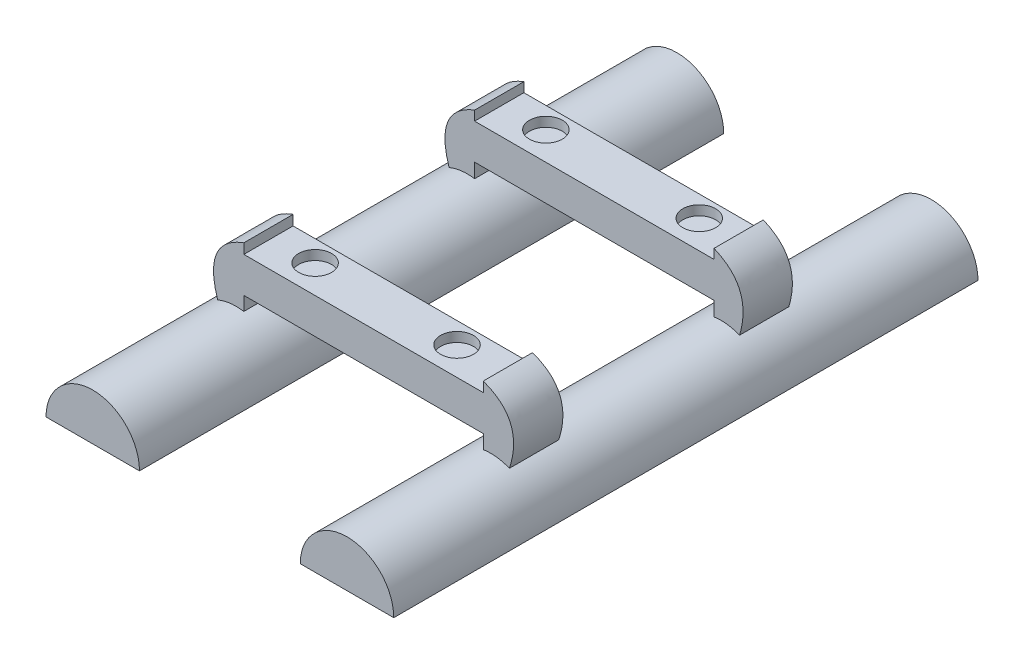
ISO-10303-21;
HEADER;
FILE_DESCRIPTION(('STEP AP214'),'2;1');
FILE_NAME('part.step','',(''),(''),'','','');
FILE_SCHEMA(('AUTOMOTIVE_DESIGN { 1 0 10303 214 1 1 1 1 }'));
ENDSEC;
DATA;
#1=APPLICATION_CONTEXT('core data for automotive mechanical design processes');
#2=APPLICATION_PROTOCOL_DEFINITION('international standard','automotive_design',2000,#1);
#3=PRODUCT_CONTEXT('',#1,'mechanical');
#4=PRODUCT('Part','Part','',(#3));
#5=PRODUCT_RELATED_PRODUCT_CATEGORY('part','',(#4));
#6=PRODUCT_DEFINITION_FORMATION('','',#4);
#7=PRODUCT_DEFINITION_CONTEXT('part definition',#1,'design');
#8=PRODUCT_DEFINITION('design','',#6,#7);
#9=PRODUCT_DEFINITION_SHAPE('','',#8);
#10=(LENGTH_UNIT() NAMED_UNIT(*) SI_UNIT(.MILLI.,.METRE.));
#11=(NAMED_UNIT(*) PLANE_ANGLE_UNIT() SI_UNIT($,.RADIAN.));
#12=(NAMED_UNIT(*) SI_UNIT($,.STERADIAN.) SOLID_ANGLE_UNIT());
#13=UNCERTAINTY_MEASURE_WITH_UNIT(LENGTH_MEASURE(1.E-05),#10,'distance_accuracy_value','');
#14=(GEOMETRIC_REPRESENTATION_CONTEXT(3) GLOBAL_UNCERTAINTY_ASSIGNED_CONTEXT((#13)) GLOBAL_UNIT_ASSIGNED_CONTEXT((#10,
#11,#12)) REPRESENTATION_CONTEXT('',''));
#15=CARTESIAN_POINT('',(0.,0.,0.));
#16=DIRECTION('',(0.,0.,1.));
#17=DIRECTION('',(1.,0.,0.));
#18=AXIS2_PLACEMENT_3D('',#15,#16,#17);
#19=CARTESIAN_POINT('',(-25.,12.6411972164317,81.71));
#20=DIRECTION('',(0.,0.,-1.));
#21=DIRECTION('',(-1.,0.,0.));
#22=AXIS2_PLACEMENT_3D('',#19,#20,#21);
#23=PLANE('',#22);
#24=DIRECTION('',(1.,0.,0.));
#25=VECTOR('',#24,1.);
#26=CARTESIAN_POINT('',(-25.,20.0511972164317,81.71));
#27=LINE('',#26,#25);
#28=CARTESIAN_POINT('',(-25.,20.0511972164317,81.71));
#29=VERTEX_POINT('',#28);
#30=CARTESIAN_POINT('',(25.,20.0511972164317,81.71));
#31=VERTEX_POINT('',#30);
#32=EDGE_CURVE('E68',#29,#31,#27,.T.);
#33=ORIENTED_EDGE('',*,*,#32,.T.);
#34=DIRECTION('',(0.,1.,0.));
#35=VECTOR('',#34,1.);
#36=CARTESIAN_POINT('',(25.,12.6411972164317,81.71));
#37=LINE('',#36,#35);
#38=CARTESIAN_POINT('',(25.,12.6411972164317,81.71));
#39=VERTEX_POINT('',#38);
#40=EDGE_CURVE('E12',#39,#31,#37,.T.);
#41=ORIENTED_EDGE('',*,*,#40,.F.);
#42=DIRECTION('',(1.,0.,0.));
#43=VECTOR('',#42,1.);
#44=CARTESIAN_POINT('',(-25.,12.6411972164317,81.71));
#45=LINE('',#44,#43);
#46=CARTESIAN_POINT('',(-25.,12.6411972164317,81.71));
#47=VERTEX_POINT('',#46);
#48=EDGE_CURVE('E214',#47,#39,#45,.T.);
#49=ORIENTED_EDGE('',*,*,#48,.F.);
#50=DIRECTION('',(0.,1.,0.));
#51=VECTOR('',#50,1.);
#52=CARTESIAN_POINT('',(-25.,12.6411972164317,81.71));
#53=LINE('',#52,#51);
#54=EDGE_CURVE('E228',#47,#29,#53,.T.);
#55=ORIENTED_EDGE('',*,*,#54,.T.);
#56=EDGE_LOOP('',(#33,#41,#49,#55));
#57=FACE_BOUND('',#56,.T.);
#58=ADVANCED_FACE('F53',(#57),#23,.T.);
#59=CARTESIAN_POINT('',(-25.,12.6411972164317,81.71));
#60=DIRECTION('',(0.,-1.,0.));
#61=DIRECTION('',(0.,0.,-1.));
#62=AXIS2_PLACEMENT_3D('',#59,#60,#61);
#63=PLANE('',#62);
#64=ORIENTED_EDGE('',*,*,#48,.T.);
#65=DIRECTION('',(0.,0.,-1.));
#66=VECTOR('',#65,1.);
#67=CARTESIAN_POINT('',(25.,12.6411972164317,81.71));
#68=LINE('',#67,#66);
#69=CARTESIAN_POINT('',(25.,12.6411972164317,92.));
#70=VERTEX_POINT('',#69);
#71=EDGE_CURVE('E230',#70,#39,#68,.T.);
#72=ORIENTED_EDGE('',*,*,#71,.F.);
#73=DIRECTION('',(1.,0.,0.));
#74=VECTOR('',#73,1.);
#75=CARTESIAN_POINT('',(-25.,12.6411972164317,92.));
#76=LINE('',#75,#74);
#77=CARTESIAN_POINT('',(-25.,12.6411972164317,92.));
#78=VERTEX_POINT('',#77);
#79=EDGE_CURVE('E221',#78,#70,#76,.T.);
#80=ORIENTED_EDGE('',*,*,#79,.F.);
#81=DIRECTION('',(0.,0.,-1.));
#82=VECTOR('',#81,1.);
#83=CARTESIAN_POINT('',(-25.,12.6411972164317,81.71));
#84=LINE('',#83,#82);
#85=EDGE_CURVE('E219',#78,#47,#84,.T.);
#86=ORIENTED_EDGE('',*,*,#85,.T.);
#87=EDGE_LOOP('',(#64,#72,#80,#86));
#88=FACE_BOUND('',#87,.T.);
#89=ADVANCED_FACE('F55',(#88),#63,.T.);
#90=CARTESIAN_POINT('',(-25.,12.6411972164317,92.));
#91=DIRECTION('',(0.,0.,1.));
#92=DIRECTION('',(1.,0.,0.));
#93=AXIS2_PLACEMENT_3D('',#90,#91,#92);
#94=PLANE('',#93);
#95=ORIENTED_EDGE('',*,*,#79,.T.);
#96=DIRECTION('',(0.,1.,0.));
#97=VECTOR('',#96,1.);
#98=CARTESIAN_POINT('',(25.,20.0511972164317,92.));
#99=LINE('',#98,#97);
#100=CARTESIAN_POINT('',(25.,9.73296037615025,92.));
#101=VERTEX_POINT('',#100);
#102=EDGE_CURVE('E239',#101,#70,#99,.T.);
#103=ORIENTED_EDGE('',*,*,#102,.F.);
#104=CARTESIAN_POINT('',(30.4615642928468,9.09765470835602,92.));
#105=CARTESIAN_POINT('',(27.8317367818681,10.1775547639994,92.));
#106=CARTESIAN_POINT('',(25.,9.73296037615025,92.));
#107=B_SPLINE_CURVE_WITH_KNOTS('',2,(#104,#105,#106),.UNSPECIFIED.,.F.,.F.,(3,3),(0.,1.),.UNSPECIFIED.);
#108=CARTESIAN_POINT('',(30.4615642928468,9.09765470835602,92.));
#109=VERTEX_POINT('',#108);
#110=EDGE_CURVE('E197',#109,#101,#107,.T.);
#111=ORIENTED_EDGE('',*,*,#110,.F.);
#112=CARTESIAN_POINT('',(25.,22.1480224752229,92.));
#113=CARTESIAN_POINT('',(33.6760119336601,18.9798813684864,92.));
#114=CARTESIAN_POINT('',(30.4615642928468,9.09765470835602,92.));
#115=B_SPLINE_CURVE_WITH_KNOTS('',2,(#112,#113,#114),.UNSPECIFIED.,.F.,.F.,(3,3),(0.,1.),.UNSPECIFIED.);
#116=CARTESIAN_POINT('',(25.,22.1480224752229,92.));
#117=VERTEX_POINT('',#116);
#118=EDGE_CURVE('E204',#117,#109,#115,.T.);
#119=ORIENTED_EDGE('',*,*,#118,.F.);
#120=CARTESIAN_POINT('',(25.,20.0511972164317,92.));
#121=VERTEX_POINT('',#120);
#122=EDGE_CURVE('E234',#121,#117,#99,.T.);
#123=ORIENTED_EDGE('',*,*,#122,.F.);
#124=DIRECTION('',(1.,0.,0.));
#125=VECTOR('',#124,1.);
#126=CARTESIAN_POINT('',(-25.,20.0511972164317,92.));
#127=LINE('',#126,#125);
#128=CARTESIAN_POINT('',(-25.,20.0511972164317,92.));
#129=VERTEX_POINT('',#128);
#130=EDGE_CURVE('E75',#129,#121,#127,.T.);
#131=ORIENTED_EDGE('',*,*,#130,.F.);
#132=DIRECTION('',(0.,-1.,0.));
#133=VECTOR('',#132,1.);
#134=CARTESIAN_POINT('',(-25.,20.0511972164317,92.));
#135=LINE('',#134,#133);
#136=CARTESIAN_POINT('',(-25.,22.1480224752229,92.));
#137=VERTEX_POINT('',#136);
#138=EDGE_CURVE('E135',#137,#129,#135,.T.);
#139=ORIENTED_EDGE('',*,*,#138,.F.);
#140=CARTESIAN_POINT('',(-30.4615642928468,9.09765470835604,92.));
#141=CARTESIAN_POINT('',(-33.6760119336601,18.9798813684864,92.));
#142=CARTESIAN_POINT('',(-25.,22.1480224752229,92.));
#143=B_SPLINE_CURVE_WITH_KNOTS('',2,(#140,#141,#142),.UNSPECIFIED.,.F.,.F.,(3,3),(0.,1.),.UNSPECIFIED.);
#144=CARTESIAN_POINT('',(-30.4615642928468,9.09765470835604,92.));
#145=VERTEX_POINT('',#144);
#146=EDGE_CURVE('E150',#145,#137,#143,.T.);
#147=ORIENTED_EDGE('',*,*,#146,.F.);
#148=CARTESIAN_POINT('',(-25.,9.73296037615026,92.));
#149=CARTESIAN_POINT('',(-27.8317367818681,10.1775547639994,92.));
#150=CARTESIAN_POINT('',(-30.4615642928468,9.09765470835604,92.));
#151=B_SPLINE_CURVE_WITH_KNOTS('',2,(#148,#149,#150),.UNSPECIFIED.,.F.,.F.,(3,3),(0.,1.),.UNSPECIFIED.);
#152=CARTESIAN_POINT('',(-25.,9.73296037615026,92.));
#153=VERTEX_POINT('',#152);
#154=EDGE_CURVE('E157',#153,#145,#151,.T.);
#155=ORIENTED_EDGE('',*,*,#154,.F.);
#156=EDGE_CURVE('E153',#78,#153,#135,.T.);
#157=ORIENTED_EDGE('',*,*,#156,.F.);
#158=EDGE_LOOP('',(#95,#103,#111,#119,#123,#131,#139,#147,#155,#157));
#159=FACE_BOUND('',#158,.T.);
#160=ADVANCED_FACE('F148',(#159),#94,.T.);
#161=CARTESIAN_POINT('',(-25.,20.0511972164317,81.71));
#162=DIRECTION('',(0.,1.,0.));
#163=DIRECTION('',(0.,0.,1.));
#164=AXIS2_PLACEMENT_3D('',#161,#162,#163);
#165=PLANE('',#164);
#166=CARTESIAN_POINT('',(13.62,20.0511972164317,86.1));
#167=DIRECTION('',(0.,1.,0.));
#168=DIRECTION('',(0.,0.,1.));
#169=AXIS2_PLACEMENT_3D('',#166,#167,#168);
#170=CIRCLE('',#169,3.43499999999874);
#171=CARTESIAN_POINT('',(13.62,20.0511972164317,89.5349999999988));
#172=VERTEX_POINT('',#171);
#173=EDGE_CURVE('E143',#172,#172,#170,.T.);
#174=ORIENTED_EDGE('',*,*,#173,.F.);
#175=EDGE_LOOP('',(#174));
#176=FACE_BOUND('',#175,.T.);
#177=CARTESIAN_POINT('',(-16.01,20.0511972164317,86.1));
#178=DIRECTION('',(0.,1.,0.));
#179=DIRECTION('',(0.,0.,1.));
#180=AXIS2_PLACEMENT_3D('',#177,#178,#179);
#181=CIRCLE('',#180,3.43499999999873);
#182=CARTESIAN_POINT('',(-16.01,20.0511972164317,89.5349999999987));
#183=VERTEX_POINT('',#182);
#184=EDGE_CURVE('E281',#183,#183,#181,.T.);
#185=ORIENTED_EDGE('',*,*,#184,.F.);
#186=EDGE_LOOP('',(#185));
#187=FACE_BOUND('',#186,.T.);
#188=ORIENTED_EDGE('',*,*,#130,.T.);
#189=DIRECTION('',(0.,0.,1.));
#190=VECTOR('',#189,1.);
#191=CARTESIAN_POINT('',(25.,20.0511972164317,81.71));
#192=LINE('',#191,#190);
#193=EDGE_CURVE('E61',#31,#121,#192,.T.);
#194=ORIENTED_EDGE('',*,*,#193,.F.);
#195=ORIENTED_EDGE('',*,*,#32,.F.);
#196=DIRECTION('',(0.,0.,1.));
#197=VECTOR('',#196,1.);
#198=CARTESIAN_POINT('',(-25.,20.0511972164317,81.71));
#199=LINE('',#198,#197);
#200=EDGE_CURVE('E226',#29,#129,#199,.T.);
#201=ORIENTED_EDGE('',*,*,#200,.T.);
#202=EDGE_LOOP('',(#188,#194,#195,#201));
#203=FACE_BOUND('',#202,.T.);
#204=ADVANCED_FACE('F193',(#176,#187,#203),#165,.T.);
#205=DIRECTION('',(0.,0.,-1.));
#206=VECTOR('',#205,1.);
#207=SURFACE_OF_LINEAR_EXTRUSION('',#107,#206);
#208=DIRECTION('',(0.,0.,-1.));
#209=VECTOR('',#208,1.);
#210=CARTESIAN_POINT('',(25.,9.73296037615025,92.));
#211=LINE('',#210,#209);
#212=CARTESIAN_POINT('',(25.,9.73296037615025,81.709));
#213=VERTEX_POINT('',#212);
#214=EDGE_CURVE('E209',#101,#213,#211,.T.);
#215=ORIENTED_EDGE('',*,*,#214,.T.);
#216=CARTESIAN_POINT('',(30.4615642928468,9.09765470835602,81.709));
#217=CARTESIAN_POINT('',(27.8317367818681,10.1775547639994,81.709));
#218=CARTESIAN_POINT('',(25.,9.73296037615025,81.709));
#219=B_SPLINE_CURVE_WITH_KNOTS('',2,(#216,#217,#218),.UNSPECIFIED.,.F.,.F.,(3,3),(0.,1.),.UNSPECIFIED.);
#220=CARTESIAN_POINT('',(30.4615642928468,9.09765470835602,81.709));
#221=VERTEX_POINT('',#220);
#222=EDGE_CURVE('E240',#221,#213,#219,.T.);
#223=ORIENTED_EDGE('',*,*,#222,.F.);
#224=DIRECTION('',(0.,0.,-1.));
#225=VECTOR('',#224,1.);
#226=CARTESIAN_POINT('',(30.4615642928468,9.09765470835602,92.));
#227=LINE('',#226,#225);
#228=EDGE_CURVE('E215',#109,#221,#227,.T.);
#229=ORIENTED_EDGE('',*,*,#228,.F.);
#230=ORIENTED_EDGE('',*,*,#110,.T.);
#231=EDGE_LOOP('',(#215,#223,#229,#230));
#232=FACE_BOUND('',#231,.T.);
#233=ADVANCED_FACE('F188',(#232),#207,.T.);
#234=DIRECTION('',(0.,0.,-1.));
#235=VECTOR('',#234,1.);
#236=SURFACE_OF_LINEAR_EXTRUSION('',#115,#235);
#237=ORIENTED_EDGE('',*,*,#228,.T.);
#238=CARTESIAN_POINT('',(25.,22.1480224752229,81.709));
#239=CARTESIAN_POINT('',(33.6760119336601,18.9798813684864,81.709));
#240=CARTESIAN_POINT('',(30.4615642928468,9.09765470835602,81.709));
#241=B_SPLINE_CURVE_WITH_KNOTS('',2,(#238,#239,#240),.UNSPECIFIED.,.F.,.F.,(3,3),(0.,1.),.UNSPECIFIED.);
#242=CARTESIAN_POINT('',(25.,22.1480224752229,81.709));
#243=VERTEX_POINT('',#242);
#244=EDGE_CURVE('E242',#243,#221,#241,.T.);
#245=ORIENTED_EDGE('',*,*,#244,.F.);
#246=DIRECTION('',(0.,0.,-1.));
#247=VECTOR('',#246,1.);
#248=CARTESIAN_POINT('',(25.,22.1480224752229,92.));
#249=LINE('',#248,#247);
#250=EDGE_CURVE('E203',#117,#243,#249,.T.);
#251=ORIENTED_EDGE('',*,*,#250,.F.);
#252=ORIENTED_EDGE('',*,*,#118,.T.);
#253=EDGE_LOOP('',(#237,#245,#251,#252));
#254=FACE_BOUND('',#253,.T.);
#255=ADVANCED_FACE('F192',(#254),#236,.T.);
#256=CARTESIAN_POINT('',(25.,20.0511972164317,92.));
#257=DIRECTION('',(-1.,0.,0.));
#258=DIRECTION('',(0.,0.,1.));
#259=AXIS2_PLACEMENT_3D('',#256,#257,#258);
#260=PLANE('',#259);
#261=ORIENTED_EDGE('',*,*,#102,.T.);
#262=ORIENTED_EDGE('',*,*,#71,.T.);
#263=ORIENTED_EDGE('',*,*,#40,.T.);
#264=ORIENTED_EDGE('',*,*,#193,.T.);
#265=ORIENTED_EDGE('',*,*,#122,.T.);
#266=ORIENTED_EDGE('',*,*,#250,.T.);
#267=DIRECTION('',(0.,1.,0.));
#268=VECTOR('',#267,1.);
#269=CARTESIAN_POINT('',(25.,20.0511972164317,81.709));
#270=LINE('',#269,#268);
#271=EDGE_CURVE('E254',#213,#243,#270,.T.);
#272=ORIENTED_EDGE('',*,*,#271,.F.);
#273=ORIENTED_EDGE('',*,*,#214,.F.);
#274=EDGE_LOOP('',(#261,#262,#263,#264,#265,#266,#272,#273));
#275=FACE_BOUND('',#274,.T.);
#276=ADVANCED_FACE('F186',(#275),#260,.T.);
#277=CARTESIAN_POINT('',(27.7812594641457,9.79643115312627,81.709));
#278=DIRECTION('',(0.,0.,1.));
#279=DIRECTION('',(1.,0.,0.));
#280=AXIS2_PLACEMENT_3D('',#277,#278,#279);
#281=PLANE('',#280);
#282=ORIENTED_EDGE('',*,*,#271,.T.);
#283=ORIENTED_EDGE('',*,*,#244,.T.);
#284=ORIENTED_EDGE('',*,*,#222,.T.);
#285=EDGE_LOOP('',(#282,#283,#284));
#286=FACE_BOUND('',#285,.T.);
#287=ADVANCED_FACE('F177',(#286),#281,.F.);
#288=DIRECTION('',(0.,0.,-1.));
#289=VECTOR('',#288,1.);
#290=SURFACE_OF_LINEAR_EXTRUSION('',#143,#289);
#291=DIRECTION('',(0.,0.,-1.));
#292=VECTOR('',#291,1.);
#293=CARTESIAN_POINT('',(-25.,22.1480224752229,92.));
#294=LINE('',#293,#292);
#295=CARTESIAN_POINT('',(-25.,22.1480224752229,81.709));
#296=VERTEX_POINT('',#295);
#297=EDGE_CURVE('E132',#137,#296,#294,.T.);
#298=ORIENTED_EDGE('',*,*,#297,.T.);
#299=CARTESIAN_POINT('',(-30.4615642928468,9.09765470835604,81.709));
#300=CARTESIAN_POINT('',(-33.6760119336601,18.9798813684864,81.709));
#301=CARTESIAN_POINT('',(-25.,22.1480224752229,81.709));
#302=B_SPLINE_CURVE_WITH_KNOTS('',2,(#299,#300,#301),.UNSPECIFIED.,.F.,.F.,(3,3),(0.,1.),.UNSPECIFIED.);
#303=CARTESIAN_POINT('',(-30.4615642928468,9.09765470835604,81.709));
#304=VERTEX_POINT('',#303);
#305=EDGE_CURVE('E152',#304,#296,#302,.T.);
#306=ORIENTED_EDGE('',*,*,#305,.F.);
#307=DIRECTION('',(0.,0.,-1.));
#308=VECTOR('',#307,1.);
#309=CARTESIAN_POINT('',(-30.4615642928468,9.09765470835604,92.));
#310=LINE('',#309,#308);
#311=EDGE_CURVE('E142',#145,#304,#310,.T.);
#312=ORIENTED_EDGE('',*,*,#311,.F.);
#313=ORIENTED_EDGE('',*,*,#146,.T.);
#314=EDGE_LOOP('',(#298,#306,#312,#313));
#315=FACE_BOUND('',#314,.T.);
#316=ADVANCED_FACE('F155',(#315),#290,.T.);
#317=DIRECTION('',(0.,0.,-1.));
#318=VECTOR('',#317,1.);
#319=SURFACE_OF_LINEAR_EXTRUSION('',#151,#318);
#320=ORIENTED_EDGE('',*,*,#311,.T.);
#321=CARTESIAN_POINT('',(-25.,9.73296037615026,81.709));
#322=CARTESIAN_POINT('',(-27.8317367818681,10.1775547639994,81.709));
#323=CARTESIAN_POINT('',(-30.4615642928468,9.09765470835604,81.709));
#324=B_SPLINE_CURVE_WITH_KNOTS('',2,(#321,#322,#323),.UNSPECIFIED.,.F.,.F.,(3,3),(0.,1.),.UNSPECIFIED.);
#325=CARTESIAN_POINT('',(-25.,9.73296037615026,81.709));
#326=VERTEX_POINT('',#325);
#327=EDGE_CURVE('E261',#326,#304,#324,.T.);
#328=ORIENTED_EDGE('',*,*,#327,.F.);
#329=DIRECTION('',(0.,0.,-1.));
#330=VECTOR('',#329,1.);
#331=CARTESIAN_POINT('',(-25.,9.73296037615026,92.));
#332=LINE('',#331,#330);
#333=EDGE_CURVE('E158',#153,#326,#332,.T.);
#334=ORIENTED_EDGE('',*,*,#333,.F.);
#335=ORIENTED_EDGE('',*,*,#154,.T.);
#336=EDGE_LOOP('',(#320,#328,#334,#335));
#337=FACE_BOUND('',#336,.T.);
#338=ADVANCED_FACE('F176',(#337),#319,.T.);
#339=CARTESIAN_POINT('',(-25.,20.0511972164317,92.));
#340=DIRECTION('',(1.,0.,0.));
#341=DIRECTION('',(0.,0.,-1.));
#342=AXIS2_PLACEMENT_3D('',#339,#340,#341);
#343=PLANE('',#342);
#344=ORIENTED_EDGE('',*,*,#54,.F.);
#345=ORIENTED_EDGE('',*,*,#85,.F.);
#346=ORIENTED_EDGE('',*,*,#156,.T.);
#347=ORIENTED_EDGE('',*,*,#333,.T.);
#348=DIRECTION('',(0.,-1.,0.));
#349=VECTOR('',#348,1.);
#350=CARTESIAN_POINT('',(-25.,20.0511972164317,81.709));
#351=LINE('',#350,#349);
#352=EDGE_CURVE('E137',#296,#326,#351,.T.);
#353=ORIENTED_EDGE('',*,*,#352,.F.);
#354=ORIENTED_EDGE('',*,*,#297,.F.);
#355=ORIENTED_EDGE('',*,*,#138,.T.);
#356=ORIENTED_EDGE('',*,*,#200,.F.);
#357=EDGE_LOOP('',(#344,#345,#346,#347,#353,#354,#355,#356));
#358=FACE_BOUND('',#357,.T.);
#359=ADVANCED_FACE('F134',(#358),#343,.T.);
#360=CARTESIAN_POINT('',(-30.7033970400417,17.301359980138,81.709));
#361=DIRECTION('',(0.,0.,-1.));
#362=DIRECTION('',(-1.,0.,0.));
#363=AXIS2_PLACEMENT_3D('',#360,#361,#362);
#364=PLANE('',#363);
#365=ORIENTED_EDGE('',*,*,#352,.T.);
#366=ORIENTED_EDGE('',*,*,#327,.T.);
#367=ORIENTED_EDGE('',*,*,#305,.T.);
#368=EDGE_LOOP('',(#365,#366,#367));
#369=FACE_BOUND('',#368,.T.);
#370=ADVANCED_FACE('F179',(#369),#364,.T.);
#371=CARTESIAN_POINT('',(-16.01,18.0511972164317,86.1));
#372=DIRECTION('',(0.,1.,0.));
#373=DIRECTION('',(0.,0.,1.));
#374=AXIS2_PLACEMENT_3D('',#371,#372,#373);
#375=CYLINDRICAL_SURFACE('',#374,3.43499999999873);
#376=CARTESIAN_POINT('',(-16.01,18.0511972164317,86.1));
#377=DIRECTION('',(0.,1.,0.));
#378=DIRECTION('',(0.,0.,1.));
#379=AXIS2_PLACEMENT_3D('',#376,#377,#378);
#380=CIRCLE('',#379,3.43499999999873);
#381=CARTESIAN_POINT('',(-16.01,18.0511972164317,89.5349999999987));
#382=VERTEX_POINT('',#381);
#383=EDGE_CURVE('E278',#382,#382,#380,.T.);
#384=ORIENTED_EDGE('',*,*,#383,.F.);
#385=EDGE_LOOP('',(#384));
#386=FACE_BOUND('',#385,.T.);
#387=ORIENTED_EDGE('',*,*,#184,.T.);
#388=EDGE_LOOP('',(#387));
#389=FACE_BOUND('',#388,.T.);
#390=ADVANCED_FACE('F182',(#386,#389),#375,.F.);
#391=CARTESIAN_POINT('',(-16.01,18.0511972164317,86.1));
#392=DIRECTION('',(0.,1.,0.));
#393=DIRECTION('',(0.,0.,1.));
#394=AXIS2_PLACEMENT_3D('',#391,#392,#393);
#395=PLANE('',#394);
#396=ORIENTED_EDGE('',*,*,#383,.T.);
#397=EDGE_LOOP('',(#396));
#398=FACE_BOUND('',#397,.T.);
#399=ADVANCED_FACE('F298',(#398),#395,.T.);
#400=CARTESIAN_POINT('',(13.62,18.0511972164317,86.1));
#401=DIRECTION('',(0.,1.,0.));
#402=DIRECTION('',(0.,0.,1.));
#403=AXIS2_PLACEMENT_3D('',#400,#401,#402);
#404=CYLINDRICAL_SURFACE('',#403,3.43499999999874);
#405=CARTESIAN_POINT('',(13.62,18.0511972164317,86.1));
#406=DIRECTION('',(0.,1.,0.));
#407=DIRECTION('',(0.,0.,1.));
#408=AXIS2_PLACEMENT_3D('',#405,#406,#407);
#409=CIRCLE('',#408,3.43499999999874);
#410=CARTESIAN_POINT('',(13.62,18.0511972164317,89.5349999999988));
#411=VERTEX_POINT('',#410);
#412=EDGE_CURVE('E284',#411,#411,#409,.T.);
#413=ORIENTED_EDGE('',*,*,#412,.F.);
#414=EDGE_LOOP('',(#413));
#415=FACE_BOUND('',#414,.T.);
#416=ORIENTED_EDGE('',*,*,#173,.T.);
#417=EDGE_LOOP('',(#416));
#418=FACE_BOUND('',#417,.T.);
#419=ADVANCED_FACE('F290',(#415,#418),#404,.F.);
#420=CARTESIAN_POINT('',(13.62,18.0511972164317,86.1));
#421=DIRECTION('',(0.,1.,0.));
#422=DIRECTION('',(0.,0.,1.));
#423=AXIS2_PLACEMENT_3D('',#420,#421,#422);
#424=PLANE('',#423);
#425=ORIENTED_EDGE('',*,*,#412,.T.);
#426=EDGE_LOOP('',(#425));
#427=FACE_BOUND('',#426,.T.);
#428=ADVANCED_FACE('F390',(#427),#424,.T.);
#429=CLOSED_SHELL('',(#58,#89,#160,#204,#233,#255,#276,#287,#316,#338,#359,#370,#390,#399,#419,#428));
#430=MANIFOLD_SOLID_BREP('B2',#429);
#431=CARTESIAN_POINT('',(-26.55,0.,122.));
#432=DIRECTION('',(0.,0.,-1.));
#433=DIRECTION('',(-1.,0.,0.));
#434=AXIS2_PLACEMENT_3D('',#431,#432,#433);
#435=CYLINDRICAL_SURFACE('',#434,9.76);
#436=DIRECTION('',(0.,0.,-1.));
#437=VECTOR('',#436,1.);
#438=CARTESIAN_POINT('',(-25.,9.63613511735907,43.81));
#439=LINE('',#438,#437);
#440=CARTESIAN_POINT('',(-25.,9.63613511735907,43.81));
#441=VERTEX_POINT('',#440);
#442=CARTESIAN_POINT('',(-25.,9.63613511735903,33.519));
#443=VERTEX_POINT('',#442);
#444=EDGE_CURVE('E586',#441,#443,#439,.T.);
#445=ORIENTED_EDGE('',*,*,#444,.F.);
#446=CARTESIAN_POINT('',(-26.55,0.,43.8100000000001));
#447=DIRECTION('',(0.,0.,1.));
#448=DIRECTION('',(0.158811475409836,0.987308925958918,0.));
#449=AXIS2_PLACEMENT_3D('',#446,#447,#448);
#450=CIRCLE('',#449,9.76);
#451=CARTESIAN_POINT('',(-27.9529698135062,9.65863736260924,43.81));
#452=VERTEX_POINT('',#451);
#453=EDGE_CURVE('E51',#441,#452,#450,.T.);
#454=ORIENTED_EDGE('',*,*,#453,.T.);
#455=CARTESIAN_POINT('',(-26.55,0.,43.8100000000001));
#456=DIRECTION('',(0.,0.,1.));
#457=DIRECTION('',(-0.143746907121218,0.98961448387394,0.));
#458=AXIS2_PLACEMENT_3D('',#455,#456,#457);
#459=CIRCLE('',#458,9.76);
#460=CARTESIAN_POINT('',(-30.3239461071731,9.00082944956484,43.81));
#461=VERTEX_POINT('',#460);
#462=EDGE_CURVE('E490',#452,#461,#459,.T.);
#463=ORIENTED_EDGE('',*,*,#462,.T.);
#464=DIRECTION('',(0.,0.,-1.));
#465=VECTOR('',#464,1.);
#466=CARTESIAN_POINT('',(-30.3239461071731,9.00082944956484,43.81));
#467=LINE('',#466,#465);
#468=CARTESIAN_POINT('',(-30.3239461071731,9.00082944956483,33.519));
#469=VERTEX_POINT('',#468);
#470=EDGE_CURVE('E827',#461,#469,#467,.T.);
#471=ORIENTED_EDGE('',*,*,#470,.T.);
#472=CARTESIAN_POINT('',(-26.55,0.,33.5190000000001));
#473=DIRECTION('',(0.,0.,-1.));
#474=DIRECTION('',(-0.386674806062816,0.922216132127542,0.));
#475=AXIS2_PLACEMENT_3D('',#472,#473,#474);
#476=CIRCLE('',#475,9.76);
#477=CARTESIAN_POINT('',(-27.9529698135024,9.65863736260977,33.519));
#478=VERTEX_POINT('',#477);
#479=EDGE_CURVE('E564',#469,#478,#476,.T.);
#480=ORIENTED_EDGE('',*,*,#479,.T.);
#481=CARTESIAN_POINT('',(-26.55,0.,33.5190000000001));
#482=DIRECTION('',(0.,0.,-1.));
#483=DIRECTION('',(-0.143746907121152,0.989614483873949,0.));
#484=AXIS2_PLACEMENT_3D('',#481,#482,#483);
#485=CIRCLE('',#484,9.76);
#486=EDGE_CURVE('E546',#478,#443,#485,.T.);
#487=ORIENTED_EDGE('',*,*,#486,.T.);
#488=EDGE_LOOP('',(#445,#454,#463,#471,#480,#487));
#489=FACE_BOUND('',#488,.T.);
#490=CARTESIAN_POINT('',(-26.55,0.,0.));
#491=DIRECTION('',(0.,0.,1.));
#492=DIRECTION('',(1.,0.,0.));
#493=AXIS2_PLACEMENT_3D('',#490,#491,#492);
#494=CIRCLE('',#493,9.76);
#495=CARTESIAN_POINT('',(-16.79,0.,0.));
#496=VERTEX_POINT('',#495);
#497=CARTESIAN_POINT('',(-36.31,0.,0.));
#498=VERTEX_POINT('',#497);
#499=EDGE_CURVE('E529',#496,#498,#494,.T.);
#500=ORIENTED_EDGE('',*,*,#499,.T.);
#501=DIRECTION('',(0.,0.,-1.));
#502=VECTOR('',#501,1.);
#503=CARTESIAN_POINT('',(-36.31,0.,122.));
#504=LINE('',#503,#502);
#505=CARTESIAN_POINT('',(-36.31,0.,122.));
#506=VERTEX_POINT('',#505);
#507=EDGE_CURVE('E523',#506,#498,#504,.T.);
#508=ORIENTED_EDGE('',*,*,#507,.F.);
#509=CARTESIAN_POINT('',(-26.55,0.,122.));
#510=DIRECTION('',(0.,0.,1.));
#511=DIRECTION('',(1.,0.,0.));
#512=AXIS2_PLACEMENT_3D('',#509,#510,#511);
#513=CIRCLE('',#512,9.76);
#514=CARTESIAN_POINT('',(-16.79,0.,122.));
#515=VERTEX_POINT('',#514);
#516=EDGE_CURVE('E528',#515,#506,#513,.T.);
#517=ORIENTED_EDGE('',*,*,#516,.F.);
#518=DIRECTION('',(0.,0.,-1.));
#519=VECTOR('',#518,1.);
#520=CARTESIAN_POINT('',(-16.79,0.,122.));
#521=LINE('',#520,#519);
#522=EDGE_CURVE('E520',#515,#496,#521,.T.);
#523=ORIENTED_EDGE('',*,*,#522,.T.);
#524=EDGE_LOOP('',(#500,#508,#517,#523));
#525=FACE_BOUND('',#524,.T.);
#526=ADVANCED_FACE('F479',(#489,#525),#435,.T.);
#527=CARTESIAN_POINT('',(-16.79,0.,122.));
#528=DIRECTION('',(0.,1.,0.));
#529=DIRECTION('',(-1.,0.,0.));
#530=AXIS2_PLACEMENT_3D('',#527,#528,#529);
#531=PLANE('',#530);
#532=DIRECTION('',(1.,0.,0.));
#533=VECTOR('',#532,1.);
#534=CARTESIAN_POINT('',(-16.79,0.,0.));
#535=LINE('',#534,#533);
#536=EDGE_CURVE('E517',#498,#496,#535,.T.);
#537=ORIENTED_EDGE('',*,*,#536,.T.);
#538=ORIENTED_EDGE('',*,*,#522,.F.);
#539=DIRECTION('',(1.,0.,0.));
#540=VECTOR('',#539,1.);
#541=CARTESIAN_POINT('',(-16.79,0.,122.));
#542=LINE('',#541,#540);
#543=EDGE_CURVE('E505',#506,#515,#542,.T.);
#544=ORIENTED_EDGE('',*,*,#543,.F.);
#545=ORIENTED_EDGE('',*,*,#507,.T.);
#546=EDGE_LOOP('',(#537,#538,#544,#545));
#547=FACE_BOUND('',#546,.T.);
#548=ADVANCED_FACE('F519',(#547),#531,.F.);
#549=CARTESIAN_POINT('',(-26.55,0.,122.));
#550=DIRECTION('',(0.,0.,1.));
#551=DIRECTION('',(1.,0.,0.));
#552=AXIS2_PLACEMENT_3D('',#549,#550,#551);
#553=PLANE('',#552);
#554=ORIENTED_EDGE('',*,*,#516,.T.);
#555=ORIENTED_EDGE('',*,*,#543,.T.);
#556=EDGE_LOOP('',(#554,#555));
#557=FACE_BOUND('',#556,.T.);
#558=ADVANCED_FACE('F952',(#557),#553,.T.);
#559=CARTESIAN_POINT('',(-26.55,0.,0.));
#560=DIRECTION('',(0.,0.,1.));
#561=DIRECTION('',(1.,0.,0.));
#562=AXIS2_PLACEMENT_3D('',#559,#560,#561);
#563=PLANE('',#562);
#564=ORIENTED_EDGE('',*,*,#499,.F.);
#565=ORIENTED_EDGE('',*,*,#536,.F.);
#566=EDGE_LOOP('',(#564,#565));
#567=FACE_BOUND('',#566,.T.);
#568=ADVANCED_FACE('F534',(#567),#563,.F.);
#569=CARTESIAN_POINT('',(26.55,0.,122.));
#570=DIRECTION('',(0.,0.,-1.));
#571=DIRECTION('',(-1.,0.,0.));
#572=AXIS2_PLACEMENT_3D('',#569,#570,#571);
#573=CYLINDRICAL_SURFACE('',#572,9.76);
#574=DIRECTION('',(0.,0.,-1.));
#575=VECTOR('',#574,1.);
#576=CARTESIAN_POINT('',(30.3239461071731,9.00082944956484,43.81));
#577=LINE('',#576,#575);
#578=CARTESIAN_POINT('',(30.3239461071731,9.00082944956484,43.81));
#579=VERTEX_POINT('',#578);
#580=CARTESIAN_POINT('',(30.3239461071731,9.00082944956481,33.519));
#581=VERTEX_POINT('',#580);
#582=EDGE_CURVE('E773',#579,#581,#577,.T.);
#583=ORIENTED_EDGE('',*,*,#582,.F.);
#584=CARTESIAN_POINT('',(26.55,0.,43.8100000000001));
#585=DIRECTION('',(0.,0.,1.));
#586=DIRECTION('',(0.386674806062816,0.922216132127542,0.));
#587=AXIS2_PLACEMENT_3D('',#584,#585,#586);
#588=CIRCLE('',#587,9.76);
#589=CARTESIAN_POINT('',(27.6065914996928,9.70263955853132,43.81));
#590=VERTEX_POINT('',#589);
#591=EDGE_CURVE('E536',#579,#590,#588,.T.);
#592=ORIENTED_EDGE('',*,*,#591,.T.);
#593=CARTESIAN_POINT('',(26.55,0.,43.8100000000001));
#594=DIRECTION('',(0.,0.,1.));
#595=DIRECTION('',(0.108257325788197,0.994122905587226,0.));
#596=AXIS2_PLACEMENT_3D('',#593,#594,#595);
#597=CIRCLE('',#596,9.76);
#598=CARTESIAN_POINT('',(25.,9.63613511735907,43.81));
#599=VERTEX_POINT('',#598);
#600=EDGE_CURVE('E540',#590,#599,#597,.T.);
#601=ORIENTED_EDGE('',*,*,#600,.T.);
#602=DIRECTION('',(0.,0.,-1.));
#603=VECTOR('',#602,1.);
#604=CARTESIAN_POINT('',(25.,9.63613511735907,43.81));
#605=LINE('',#604,#603);
#606=CARTESIAN_POINT('',(25.,9.63613511735906,33.519));
#607=VERTEX_POINT('',#606);
#608=EDGE_CURVE('E695',#599,#607,#605,.T.);
#609=ORIENTED_EDGE('',*,*,#608,.T.);
#610=CARTESIAN_POINT('',(27.606591499692,9.70263955853141,33.519));
#611=CARTESIAN_POINT('',(26.2988138239237,9.84505304997032,33.519));
#612=CARTESIAN_POINT('',(25.,9.63613511735903,33.519));
#613=B_SPLINE_CURVE_WITH_KNOTS('',2,(#610,#611,#612),.UNSPECIFIED.,.F.,.F.,(3,3),(0.,1.),.UNSPECIFIED.);
#614=CARTESIAN_POINT('',(27.606591499692,9.70263955853141,33.519));
#615=VERTEX_POINT('',#614);
#616=EDGE_CURVE('E709',#615,#607,#613,.T.);
#617=ORIENTED_EDGE('',*,*,#616,.F.);
#618=CARTESIAN_POINT('',(30.3239461071731,9.0008294495648,33.519));
#619=CARTESIAN_POINT('',(29.0162504403778,9.54913146980891,33.519));
#620=CARTESIAN_POINT('',(27.606591499692,9.70263955853141,33.519));
#621=B_SPLINE_CURVE_WITH_KNOTS('',2,(#618,#619,#620),.UNSPECIFIED.,.F.,.F.,(3,3),(0.,1.),.UNSPECIFIED.);
#622=EDGE_CURVE('E781',#581,#615,#621,.T.);
#623=ORIENTED_EDGE('',*,*,#622,.F.);
#624=EDGE_LOOP('',(#583,#592,#601,#609,#617,#623));
#625=FACE_BOUND('',#624,.T.);
#626=CARTESIAN_POINT('',(26.55,0.,0.));
#627=DIRECTION('',(0.,0.,1.));
#628=DIRECTION('',(1.,0.,0.));
#629=AXIS2_PLACEMENT_3D('',#626,#627,#628);
#630=CIRCLE('',#629,9.76);
#631=CARTESIAN_POINT('',(36.31,0.,0.));
#632=VERTEX_POINT('',#631);
#633=CARTESIAN_POINT('',(16.79,0.,0.));
#634=VERTEX_POINT('',#633);
#635=EDGE_CURVE('E704',#632,#634,#630,.T.);
#636=ORIENTED_EDGE('',*,*,#635,.T.);
#637=DIRECTION('',(0.,0.,-1.));
#638=VECTOR('',#637,1.);
#639=CARTESIAN_POINT('',(16.79,0.,122.));
#640=LINE('',#639,#638);
#641=CARTESIAN_POINT('',(16.79,0.,122.));
#642=VERTEX_POINT('',#641);
#643=EDGE_CURVE('E690',#642,#634,#640,.T.);
#644=ORIENTED_EDGE('',*,*,#643,.F.);
#645=CARTESIAN_POINT('',(26.55,0.,122.));
#646=DIRECTION('',(0.,0.,1.));
#647=DIRECTION('',(1.,0.,0.));
#648=AXIS2_PLACEMENT_3D('',#645,#646,#647);
#649=CIRCLE('',#648,9.76);
#650=CARTESIAN_POINT('',(36.31,0.,122.));
#651=VERTEX_POINT('',#650);
#652=EDGE_CURVE('E705',#651,#642,#649,.T.);
#653=ORIENTED_EDGE('',*,*,#652,.F.);
#654=DIRECTION('',(0.,0.,-1.));
#655=VECTOR('',#654,1.);
#656=CARTESIAN_POINT('',(36.31,0.,122.));
#657=LINE('',#656,#655);
#658=EDGE_CURVE('E694',#651,#632,#657,.T.);
#659=ORIENTED_EDGE('',*,*,#658,.T.);
#660=EDGE_LOOP('',(#636,#644,#653,#659));
#661=FACE_BOUND('',#660,.T.);
#662=ADVANCED_FACE('F728',(#625,#661),#573,.T.);
#663=CARTESIAN_POINT('',(16.79,0.,122.));
#664=DIRECTION('',(0.,1.,0.));
#665=DIRECTION('',(0.,0.,1.));
#666=AXIS2_PLACEMENT_3D('',#663,#664,#665);
#667=PLANE('',#666);
#668=DIRECTION('',(1.,0.,0.));
#669=VECTOR('',#668,1.);
#670=CARTESIAN_POINT('',(16.79,0.,0.));
#671=LINE('',#670,#669);
#672=EDGE_CURVE('E700',#634,#632,#671,.T.);
#673=ORIENTED_EDGE('',*,*,#672,.T.);
#674=ORIENTED_EDGE('',*,*,#658,.F.);
#675=DIRECTION('',(1.,0.,0.));
#676=VECTOR('',#675,1.);
#677=CARTESIAN_POINT('',(16.79,0.,122.));
#678=LINE('',#677,#676);
#679=EDGE_CURVE('E699',#642,#651,#678,.T.);
#680=ORIENTED_EDGE('',*,*,#679,.F.);
#681=ORIENTED_EDGE('',*,*,#643,.T.);
#682=EDGE_LOOP('',(#673,#674,#680,#681));
#683=FACE_BOUND('',#682,.T.);
#684=ADVANCED_FACE('F737',(#683),#667,.F.);
#685=CARTESIAN_POINT('',(26.55,0.,122.));
#686=DIRECTION('',(0.,0.,1.));
#687=DIRECTION('',(1.,0.,0.));
#688=AXIS2_PLACEMENT_3D('',#685,#686,#687);
#689=PLANE('',#688);
#690=ORIENTED_EDGE('',*,*,#652,.T.);
#691=ORIENTED_EDGE('',*,*,#679,.T.);
#692=EDGE_LOOP('',(#690,#691));
#693=FACE_BOUND('',#692,.T.);
#694=ADVANCED_FACE('F994',(#693),#689,.T.);
#695=CARTESIAN_POINT('',(26.55,0.,0.));
#696=DIRECTION('',(0.,0.,1.));
#697=DIRECTION('',(1.,0.,0.));
#698=AXIS2_PLACEMENT_3D('',#695,#696,#697);
#699=PLANE('',#698);
#700=ORIENTED_EDGE('',*,*,#635,.F.);
#701=ORIENTED_EDGE('',*,*,#672,.F.);
#702=EDGE_LOOP('',(#700,#701));
#703=FACE_BOUND('',#702,.T.);
#704=ADVANCED_FACE('F1001',(#703),#699,.F.);
#705=CARTESIAN_POINT('',(25.,12.6411972164317,43.81));
#706=DIRECTION('',(-1.,0.,0.));
#707=DIRECTION('',(0.,0.,1.));
#708=AXIS2_PLACEMENT_3D('',#705,#706,#707);
#709=PLANE('',#708);
#710=DIRECTION('',(0.,0.,-1.));
#711=VECTOR('',#710,1.);
#712=CARTESIAN_POINT('',(25.,12.6411972164317,33.52));
#713=LINE('',#712,#711);
#714=CARTESIAN_POINT('',(25.,12.6411972164317,43.81));
#715=VERTEX_POINT('',#714);
#716=CARTESIAN_POINT('',(25.,12.6411972164317,33.52));
#717=VERTEX_POINT('',#716);
#718=EDGE_CURVE('E636',#715,#717,#713,.T.);
#719=ORIENTED_EDGE('',*,*,#718,.T.);
#720=DIRECTION('',(0.,1.,0.));
#721=VECTOR('',#720,1.);
#722=CARTESIAN_POINT('',(25.,12.6411972164317,33.52));
#723=LINE('',#722,#721);
#724=CARTESIAN_POINT('',(25.,20.0511972164317,33.52));
#725=VERTEX_POINT('',#724);
#726=EDGE_CURVE('E628',#717,#725,#723,.T.);
#727=ORIENTED_EDGE('',*,*,#726,.T.);
#728=DIRECTION('',(0.,0.,1.));
#729=VECTOR('',#728,1.);
#730=CARTESIAN_POINT('',(25.,20.0511972164317,33.52));
#731=LINE('',#730,#729);
#732=CARTESIAN_POINT('',(25.,20.0511972164317,43.81));
#733=VERTEX_POINT('',#732);
#734=EDGE_CURVE('E632',#725,#733,#731,.T.);
#735=ORIENTED_EDGE('',*,*,#734,.T.);
#736=DIRECTION('',(0.,1.,0.));
#737=VECTOR('',#736,1.);
#738=CARTESIAN_POINT('',(25.,12.6411972164317,43.81));
#739=LINE('',#738,#737);
#740=CARTESIAN_POINT('',(25.,22.0511972164317,43.81));
#741=VERTEX_POINT('',#740);
#742=EDGE_CURVE('E875',#733,#741,#739,.T.);
#743=ORIENTED_EDGE('',*,*,#742,.T.);
#744=DIRECTION('',(0.,0.,-1.));
#745=VECTOR('',#744,1.);
#746=CARTESIAN_POINT('',(25.,22.0511972164317,43.81));
#747=LINE('',#746,#745);
#748=CARTESIAN_POINT('',(25.,22.0511972164317,33.519));
#749=VERTEX_POINT('',#748);
#750=EDGE_CURVE('E670',#741,#749,#747,.T.);
#751=ORIENTED_EDGE('',*,*,#750,.T.);
#752=DIRECTION('',(0.,1.,0.));
#753=VECTOR('',#752,1.);
#754=CARTESIAN_POINT('',(25.,12.6411972164317,33.519));
#755=LINE('',#754,#753);
#756=EDGE_CURVE('E655',#607,#749,#755,.T.);
#757=ORIENTED_EDGE('',*,*,#756,.F.);
#758=ORIENTED_EDGE('',*,*,#608,.F.);
#759=EDGE_CURVE('E686',#599,#715,#739,.T.);
#760=ORIENTED_EDGE('',*,*,#759,.T.);
#761=EDGE_LOOP('',(#719,#727,#735,#743,#751,#757,#758,#760));
#762=FACE_BOUND('',#761,.T.);
#763=ADVANCED_FACE('F803',(#762),#709,.T.);
#764=CARTESIAN_POINT('',(25.,22.0511972164317,43.81));
#765=CARTESIAN_POINT('',(33.171152220329,18.587667965492,43.81));
#766=CARTESIAN_POINT('',(30.3239461071731,9.00082944956484,43.81));
#767=B_SPLINE_CURVE_WITH_KNOTS('',2,(#764,#765,#766),.UNSPECIFIED.,.F.,.F.,(3,3),(0.,1.),.UNSPECIFIED.);
#768=DIRECTION('',(0.,0.,-1.));
#769=VECTOR('',#768,1.);
#770=SURFACE_OF_LINEAR_EXTRUSION('',#767,#769);
#771=ORIENTED_EDGE('',*,*,#582,.T.);
#772=CARTESIAN_POINT('',(25.,22.0511972164317,33.519));
#773=CARTESIAN_POINT('',(33.171152220329,18.5876679654919,33.519));
#774=CARTESIAN_POINT('',(30.3239461071731,9.00082944956483,33.519));
#775=B_SPLINE_CURVE_WITH_KNOTS('',2,(#772,#773,#774),.UNSPECIFIED.,.F.,.F.,(3,3),(0.,1.),.UNSPECIFIED.);
#776=EDGE_CURVE('E871',#749,#581,#775,.T.);
#777=ORIENTED_EDGE('',*,*,#776,.F.);
#778=ORIENTED_EDGE('',*,*,#750,.F.);
#779=EDGE_CURVE('E681',#741,#579,#767,.T.);
#780=ORIENTED_EDGE('',*,*,#779,.T.);
#781=EDGE_LOOP('',(#771,#777,#778,#780));
#782=FACE_BOUND('',#781,.T.);
#783=ADVANCED_FACE('F677',(#782),#770,.T.);
#784=CARTESIAN_POINT('',(30.4165626369578,17.0568406492451,43.81));
#785=DIRECTION('',(0.,0.,1.));
#786=DIRECTION('',(0.,-1.,0.));
#787=AXIS2_PLACEMENT_3D('',#784,#785,#786);
#788=PLANE('',#787);
#789=ORIENTED_EDGE('',*,*,#453,.F.);
#790=DIRECTION('',(0.,-1.,0.));
#791=VECTOR('',#790,1.);
#792=CARTESIAN_POINT('',(-25.,20.0511972164317,43.81));
#793=LINE('',#792,#791);
#794=CARTESIAN_POINT('',(-25.,12.6411972164317,43.81));
#795=VERTEX_POINT('',#794);
#796=EDGE_CURVE('E594',#795,#441,#793,.T.);
#797=ORIENTED_EDGE('',*,*,#796,.F.);
#798=DIRECTION('',(1.,0.,0.));
#799=VECTOR('',#798,1.);
#800=CARTESIAN_POINT('',(-25.,12.6411972164317,43.81));
#801=LINE('',#800,#799);
#802=EDGE_CURVE('E656',#795,#715,#801,.T.);
#803=ORIENTED_EDGE('',*,*,#802,.T.);
#804=ORIENTED_EDGE('',*,*,#759,.F.);
#805=ORIENTED_EDGE('',*,*,#600,.F.);
#806=ORIENTED_EDGE('',*,*,#591,.F.);
#807=ORIENTED_EDGE('',*,*,#779,.F.);
#808=ORIENTED_EDGE('',*,*,#742,.F.);
#809=DIRECTION('',(1.,0.,0.));
#810=VECTOR('',#809,1.);
#811=CARTESIAN_POINT('',(-25.,20.0511972164317,43.81));
#812=LINE('',#811,#810);
#813=CARTESIAN_POINT('',(-25.,20.0511972164317,43.81));
#814=VERTEX_POINT('',#813);
#815=EDGE_CURVE('E659',#814,#733,#812,.T.);
#816=ORIENTED_EDGE('',*,*,#815,.F.);
#817=CARTESIAN_POINT('',(-25.,22.0511972164317,43.81));
#818=VERTEX_POINT('',#817);
#819=EDGE_CURVE('E609',#818,#814,#793,.T.);
#820=ORIENTED_EDGE('',*,*,#819,.F.);
#821=CARTESIAN_POINT('',(-30.3239461071731,9.00082944956484,43.81));
#822=CARTESIAN_POINT('',(-33.5042856644731,18.7731689438746,43.81));
#823=CARTESIAN_POINT('',(-25.,22.0511972164317,43.81));
#824=B_SPLINE_CURVE_WITH_KNOTS('',2,(#821,#822,#823),.UNSPECIFIED.,.F.,.F.,(3,3),(0.,1.),.UNSPECIFIED.);
#825=EDGE_CURVE('E610',#461,#818,#824,.T.);
#826=ORIENTED_EDGE('',*,*,#825,.F.);
#827=ORIENTED_EDGE('',*,*,#462,.F.);
#828=EDGE_LOOP('',(#789,#797,#803,#804,#805,#806,#807,#808,#816,#820,#826,#827));
#829=FACE_BOUND('',#828,.T.);
#830=ADVANCED_FACE('F591',(#829),#788,.T.);
#831=CARTESIAN_POINT('',(30.4165626369578,17.0568406492451,33.519));
#832=DIRECTION('',(0.,0.,1.));
#833=DIRECTION('',(0.,-1.,0.));
#834=AXIS2_PLACEMENT_3D('',#831,#832,#833);
#835=PLANE('',#834);
#836=ORIENTED_EDGE('',*,*,#776,.T.);
#837=ORIENTED_EDGE('',*,*,#622,.T.);
#838=ORIENTED_EDGE('',*,*,#616,.T.);
#839=ORIENTED_EDGE('',*,*,#756,.T.);
#840=EDGE_LOOP('',(#836,#837,#838,#839));
#841=FACE_BOUND('',#840,.T.);
#842=ADVANCED_FACE('F800',(#841),#835,.F.);
#843=CARTESIAN_POINT('',(-25.,12.6411972164317,33.52));
#844=DIRECTION('',(0.,0.,-1.));
#845=DIRECTION('',(0.,1.,0.));
#846=AXIS2_PLACEMENT_3D('',#843,#844,#845);
#847=PLANE('',#846);
#848=DIRECTION('',(1.,0.,0.));
#849=VECTOR('',#848,1.);
#850=CARTESIAN_POINT('',(-25.,20.0511972164317,33.52));
#851=LINE('',#850,#849);
#852=CARTESIAN_POINT('',(-25.,20.0511972164317,33.52));
#853=VERTEX_POINT('',#852);
#854=EDGE_CURVE('E650',#853,#725,#851,.T.);
#855=ORIENTED_EDGE('',*,*,#854,.T.);
#856=ORIENTED_EDGE('',*,*,#726,.F.);
#857=DIRECTION('',(1.,0.,0.));
#858=VECTOR('',#857,1.);
#859=CARTESIAN_POINT('',(-25.,12.6411972164317,33.52));
#860=LINE('',#859,#858);
#861=CARTESIAN_POINT('',(-25.,12.6411972164317,33.52));
#862=VERTEX_POINT('',#861);
#863=EDGE_CURVE('E651',#862,#717,#860,.T.);
#864=ORIENTED_EDGE('',*,*,#863,.F.);
#865=DIRECTION('',(0.,1.,0.));
#866=VECTOR('',#865,1.);
#867=CARTESIAN_POINT('',(-25.,12.6411972164317,33.52));
#868=LINE('',#867,#866);
#869=EDGE_CURVE('E640',#862,#853,#868,.T.);
#870=ORIENTED_EDGE('',*,*,#869,.T.);
#871=EDGE_LOOP('',(#855,#856,#864,#870));
#872=FACE_BOUND('',#871,.T.);
#873=ADVANCED_FACE('F1028',(#872),#847,.T.);
#874=CARTESIAN_POINT('',(-25.,12.6411972164317,33.52));
#875=DIRECTION('',(0.,-1.,0.));
#876=DIRECTION('',(0.,0.,-1.));
#877=AXIS2_PLACEMENT_3D('',#874,#875,#876);
#878=PLANE('',#877);
#879=ORIENTED_EDGE('',*,*,#863,.T.);
#880=ORIENTED_EDGE('',*,*,#718,.F.);
#881=ORIENTED_EDGE('',*,*,#802,.F.);
#882=DIRECTION('',(0.,0.,-1.));
#883=VECTOR('',#882,1.);
#884=CARTESIAN_POINT('',(-25.,12.6411972164317,33.52));
#885=LINE('',#884,#883);
#886=EDGE_CURVE('E606',#795,#862,#885,.T.);
#887=ORIENTED_EDGE('',*,*,#886,.T.);
#888=EDGE_LOOP('',(#879,#880,#881,#887));
#889=FACE_BOUND('',#888,.T.);
#890=ADVANCED_FACE('F849',(#889),#878,.T.);
#891=CARTESIAN_POINT('',(-25.,20.0511972164317,33.52));
#892=DIRECTION('',(0.,1.,0.));
#893=DIRECTION('',(0.,0.,1.));
#894=AXIS2_PLACEMENT_3D('',#891,#892,#893);
#895=PLANE('',#894);
#896=CARTESIAN_POINT('',(-16.01,20.0511972164317,37.91));
#897=DIRECTION('',(0.,1.,0.));
#898=DIRECTION('',(0.,0.,1.));
#899=AXIS2_PLACEMENT_3D('',#896,#897,#898);
#900=CIRCLE('',#899,3.435);
#901=CARTESIAN_POINT('',(-16.01,20.0511972164317,41.345));
#902=VERTEX_POINT('',#901);
#903=EDGE_CURVE('E1192',#902,#902,#900,.T.);
#904=ORIENTED_EDGE('',*,*,#903,.F.);
#905=EDGE_LOOP('',(#904));
#906=FACE_BOUND('',#905,.T.);
#907=CARTESIAN_POINT('',(16.01,20.0511972164317,37.91));
#908=DIRECTION('',(0.,1.,0.));
#909=DIRECTION('',(0.,0.,1.));
#910=AXIS2_PLACEMENT_3D('',#907,#908,#909);
#911=CIRCLE('',#910,3.435);
#912=CARTESIAN_POINT('',(16.01,20.0511972164317,41.345));
#913=VERTEX_POINT('',#912);
#914=EDGE_CURVE('E1198',#913,#913,#911,.T.);
#915=ORIENTED_EDGE('',*,*,#914,.F.);
#916=EDGE_LOOP('',(#915));
#917=FACE_BOUND('',#916,.T.);
#918=ORIENTED_EDGE('',*,*,#815,.T.);
#919=ORIENTED_EDGE('',*,*,#734,.F.);
#920=ORIENTED_EDGE('',*,*,#854,.F.);
#921=DIRECTION('',(0.,0.,1.));
#922=VECTOR('',#921,1.);
#923=CARTESIAN_POINT('',(-25.,20.0511972164317,33.52));
#924=LINE('',#923,#922);
#925=EDGE_CURVE('E644',#853,#814,#924,.T.);
#926=ORIENTED_EDGE('',*,*,#925,.T.);
#927=EDGE_LOOP('',(#918,#919,#920,#926));
#928=FACE_BOUND('',#927,.T.);
#929=ADVANCED_FACE('F1040',(#906,#917,#928),#895,.T.);
#930=DIRECTION('',(0.,0.,-1.));
#931=VECTOR('',#930,1.);
#932=SURFACE_OF_LINEAR_EXTRUSION('',#824,#931);
#933=DIRECTION('',(0.,0.,-1.));
#934=VECTOR('',#933,1.);
#935=CARTESIAN_POINT('',(-25.,22.0511972164317,43.81));
#936=LINE('',#935,#934);
#937=CARTESIAN_POINT('',(-25.,22.0511972164317,33.519));
#938=VERTEX_POINT('',#937);
#939=EDGE_CURVE('E830',#818,#938,#936,.T.);
#940=ORIENTED_EDGE('',*,*,#939,.T.);
#941=CARTESIAN_POINT('',(-30.3239461071731,9.00082944956483,33.519));
#942=CARTESIAN_POINT('',(-33.5042856644731,18.7731689438746,33.519));
#943=CARTESIAN_POINT('',(-25.,22.0511972164317,33.519));
#944=B_SPLINE_CURVE_WITH_KNOTS('',2,(#941,#942,#943),.UNSPECIFIED.,.F.,.F.,(3,3),(0.,1.),.UNSPECIFIED.);
#945=EDGE_CURVE('E615',#469,#938,#944,.T.);
#946=ORIENTED_EDGE('',*,*,#945,.F.);
#947=ORIENTED_EDGE('',*,*,#470,.F.);
#948=ORIENTED_EDGE('',*,*,#825,.T.);
#949=EDGE_LOOP('',(#940,#946,#947,#948));
#950=FACE_BOUND('',#949,.T.);
#951=ADVANCED_FACE('F847',(#950),#932,.T.);
#952=CARTESIAN_POINT('',(-25.,20.0511972164317,43.81));
#953=DIRECTION('',(1.,0.,0.));
#954=DIRECTION('',(0.,0.,-1.));
#955=AXIS2_PLACEMENT_3D('',#952,#953,#954);
#956=PLANE('',#955);
#957=ORIENTED_EDGE('',*,*,#869,.F.);
#958=ORIENTED_EDGE('',*,*,#886,.F.);
#959=ORIENTED_EDGE('',*,*,#796,.T.);
#960=ORIENTED_EDGE('',*,*,#444,.T.);
#961=DIRECTION('',(0.,-1.,0.));
#962=VECTOR('',#961,1.);
#963=CARTESIAN_POINT('',(-25.,20.0511972164317,33.519));
#964=LINE('',#963,#962);
#965=EDGE_CURVE('E497',#938,#443,#964,.T.);
#966=ORIENTED_EDGE('',*,*,#965,.F.);
#967=ORIENTED_EDGE('',*,*,#939,.F.);
#968=ORIENTED_EDGE('',*,*,#819,.T.);
#969=ORIENTED_EDGE('',*,*,#925,.F.);
#970=EDGE_LOOP('',(#957,#958,#959,#960,#966,#967,#968,#969));
#971=FACE_BOUND('',#970,.T.);
#972=ADVANCED_FACE('F604',(#971),#956,.T.);
#973=CARTESIAN_POINT('',(-30.5831293590298,17.1495911384364,33.519));
#974=DIRECTION('',(0.,0.,-1.));
#975=DIRECTION('',(0.,1.,0.));
#976=AXIS2_PLACEMENT_3D('',#973,#974,#975);
#977=PLANE('',#976);
#978=ORIENTED_EDGE('',*,*,#479,.F.);
#979=ORIENTED_EDGE('',*,*,#945,.T.);
#980=ORIENTED_EDGE('',*,*,#965,.T.);
#981=ORIENTED_EDGE('',*,*,#486,.F.);
#982=EDGE_LOOP('',(#978,#979,#980,#981));
#983=FACE_BOUND('',#982,.T.);
#984=ADVANCED_FACE('F836',(#983),#977,.T.);
#985=CARTESIAN_POINT('',(16.01,18.0511972164317,37.91));
#986=DIRECTION('',(0.,1.,0.));
#987=DIRECTION('',(0.,0.,1.));
#988=AXIS2_PLACEMENT_3D('',#985,#986,#987);
#989=CYLINDRICAL_SURFACE('',#988,3.435);
#990=CARTESIAN_POINT('',(16.01,18.0511972164317,37.91));
#991=DIRECTION('',(0.,1.,0.));
#992=DIRECTION('',(0.,0.,1.));
#993=AXIS2_PLACEMENT_3D('',#990,#991,#992);
#994=CIRCLE('',#993,3.435);
#995=CARTESIAN_POINT('',(16.01,18.0511972164317,41.345));
#996=VERTEX_POINT('',#995);
#997=EDGE_CURVE('E1204',#996,#996,#994,.T.);
#998=ORIENTED_EDGE('',*,*,#997,.F.);
#999=EDGE_LOOP('',(#998));
#1000=FACE_BOUND('',#999,.T.);
#1001=ORIENTED_EDGE('',*,*,#914,.T.);
#1002=EDGE_LOOP('',(#1001));
#1003=FACE_BOUND('',#1002,.T.);
#1004=ADVANCED_FACE('F846',(#1000,#1003),#989,.F.);
#1005=CARTESIAN_POINT('',(16.01,18.0511972164317,37.91));
#1006=DIRECTION('',(0.,1.,0.));
#1007=DIRECTION('',(0.,0.,1.));
#1008=AXIS2_PLACEMENT_3D('',#1005,#1006,#1007);
#1009=PLANE('',#1008);
#1010=ORIENTED_EDGE('',*,*,#997,.T.);
#1011=EDGE_LOOP('',(#1010));
#1012=FACE_BOUND('',#1011,.T.);
#1013=ADVANCED_FACE('F1068',(#1012),#1009,.T.);
#1014=CARTESIAN_POINT('',(-16.01,18.0511972164317,37.91));
#1015=DIRECTION('',(0.,1.,0.));
#1016=DIRECTION('',(0.,0.,1.));
#1017=AXIS2_PLACEMENT_3D('',#1014,#1015,#1016);
#1018=CYLINDRICAL_SURFACE('',#1017,3.435);
#1019=CARTESIAN_POINT('',(-16.01,18.0511972164317,37.91));
#1020=DIRECTION('',(0.,1.,0.));
#1021=DIRECTION('',(0.,0.,1.));
#1022=AXIS2_PLACEMENT_3D('',#1019,#1020,#1021);
#1023=CIRCLE('',#1022,3.435);
#1024=CARTESIAN_POINT('',(-16.01,18.0511972164317,41.345));
#1025=VERTEX_POINT('',#1024);
#1026=EDGE_CURVE('E1190',#1025,#1025,#1023,.T.);
#1027=ORIENTED_EDGE('',*,*,#1026,.F.);
#1028=EDGE_LOOP('',(#1027));
#1029=FACE_BOUND('',#1028,.T.);
#1030=ORIENTED_EDGE('',*,*,#903,.T.);
#1031=EDGE_LOOP('',(#1030));
#1032=FACE_BOUND('',#1031,.T.);
#1033=ADVANCED_FACE('F1076',(#1029,#1032),#1018,.F.);
#1034=CARTESIAN_POINT('',(-16.01,18.0511972164317,37.91));
#1035=DIRECTION('',(0.,1.,0.));
#1036=DIRECTION('',(0.,0.,1.));
#1037=AXIS2_PLACEMENT_3D('',#1034,#1035,#1036);
#1038=PLANE('',#1037);
#1039=ORIENTED_EDGE('',*,*,#1026,.T.);
#1040=EDGE_LOOP('',(#1039));
#1041=FACE_BOUND('',#1040,.T.);
#1042=ADVANCED_FACE('F1084',(#1041),#1038,.T.);
#1043=CLOSED_SHELL('',(#526,#548,#558,#568,#662,#684,#694,#704,#763,#783,#830,#842,#873,#890,
#929,#951,#972,#984,#1004,#1013,#1033,#1042));
#1044=MANIFOLD_SOLID_BREP('B6',#1043);
#1045=ADVANCED_BREP_SHAPE_REPRESENTATION('',(#18,#430,#1044),#14);
#1046=SHAPE_DEFINITION_REPRESENTATION(#9,#1045);
ENDSEC;
END-ISO-10303-21;
